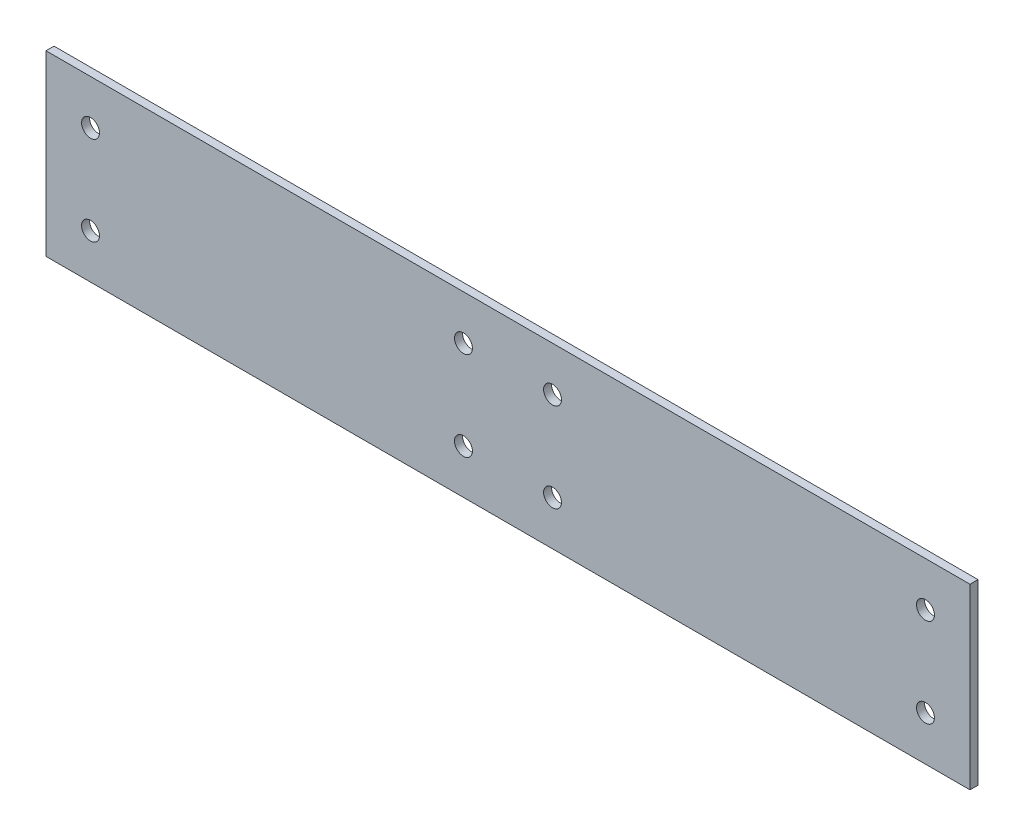
ISO-10303-21;
HEADER;
FILE_DESCRIPTION(('STEP AP214'),'2;1');
FILE_NAME('part.step','',(''),(''),'','','');
FILE_SCHEMA(('AUTOMOTIVE_DESIGN { 1 0 10303 214 1 1 1 1 }'));
ENDSEC;
DATA;
#1=APPLICATION_CONTEXT('core data for automotive mechanical design processes');
#2=APPLICATION_PROTOCOL_DEFINITION('international standard','automotive_design',2000,#1);
#3=PRODUCT_CONTEXT('',#1,'mechanical');
#4=PRODUCT('Part','Part','',(#3));
#5=PRODUCT_RELATED_PRODUCT_CATEGORY('part','',(#4));
#6=PRODUCT_DEFINITION_FORMATION('','',#4);
#7=PRODUCT_DEFINITION_CONTEXT('part definition',#1,'design');
#8=PRODUCT_DEFINITION('design','',#6,#7);
#9=PRODUCT_DEFINITION_SHAPE('','',#8);
#10=(LENGTH_UNIT() NAMED_UNIT(*) SI_UNIT(.MILLI.,.METRE.));
#11=(NAMED_UNIT(*) PLANE_ANGLE_UNIT() SI_UNIT($,.RADIAN.));
#12=(NAMED_UNIT(*) SI_UNIT($,.STERADIAN.) SOLID_ANGLE_UNIT());
#13=UNCERTAINTY_MEASURE_WITH_UNIT(LENGTH_MEASURE(1.E-05),#10,'distance_accuracy_value','');
#14=(GEOMETRIC_REPRESENTATION_CONTEXT(3) GLOBAL_UNCERTAINTY_ASSIGNED_CONTEXT((#13)) GLOBAL_UNIT_ASSIGNED_CONTEXT((#10,
#11,#12)) REPRESENTATION_CONTEXT('',''));
#15=CARTESIAN_POINT('',(0.,0.,0.));
#16=DIRECTION('',(0.,0.,1.));
#17=DIRECTION('',(1.,0.,0.));
#18=AXIS2_PLACEMENT_3D('',#15,#16,#17);
#19=CARTESIAN_POINT('',(131.7625,0.,1.143));
#20=DIRECTION('',(-1.,0.,0.));
#21=DIRECTION('',(0.,0.,1.));
#22=AXIS2_PLACEMENT_3D('',#19,#20,#21);
#23=PLANE('',#22);
#24=DIRECTION('',(0.,1.,0.));
#25=VECTOR('',#24,1.);
#26=CARTESIAN_POINT('',(131.7625,0.,-1.143));
#27=LINE('',#26,#25);
#28=CARTESIAN_POINT('',(131.7625,-25.4,-1.143));
#29=VERTEX_POINT('',#28);
#30=CARTESIAN_POINT('',(131.7625,25.4,-1.143));
#31=VERTEX_POINT('',#30);
#32=EDGE_CURVE('E98',#29,#31,#27,.T.);
#33=ORIENTED_EDGE('',*,*,#32,.T.);
#34=DIRECTION('',(0.,0.,-1.));
#35=VECTOR('',#34,1.);
#36=CARTESIAN_POINT('',(131.7625,25.4,1.143));
#37=LINE('',#36,#35);
#38=CARTESIAN_POINT('',(131.7625,25.4,1.143));
#39=VERTEX_POINT('',#38);
#40=EDGE_CURVE('E11',#39,#31,#37,.T.);
#41=ORIENTED_EDGE('',*,*,#40,.F.);
#42=DIRECTION('',(0.,1.,0.));
#43=VECTOR('',#42,1.);
#44=CARTESIAN_POINT('',(131.7625,0.,1.143));
#45=LINE('',#44,#43);
#46=CARTESIAN_POINT('',(131.7625,-25.4,1.143));
#47=VERTEX_POINT('',#46);
#48=EDGE_CURVE('E86',#47,#39,#45,.T.);
#49=ORIENTED_EDGE('',*,*,#48,.F.);
#50=DIRECTION('',(0.,0.,-1.));
#51=VECTOR('',#50,1.);
#52=CARTESIAN_POINT('',(131.7625,-25.4,1.143));
#53=LINE('',#52,#51);
#54=EDGE_CURVE('E94',#47,#29,#53,.T.);
#55=ORIENTED_EDGE('',*,*,#54,.T.);
#56=EDGE_LOOP('',(#33,#41,#49,#55));
#57=FACE_BOUND('',#56,.T.);
#58=ADVANCED_FACE('F35',(#57),#23,.F.);
#59=CARTESIAN_POINT('',(0.,25.4,1.143));
#60=DIRECTION('',(0.,-1.,0.));
#61=DIRECTION('',(1.,0.,0.));
#62=AXIS2_PLACEMENT_3D('',#59,#60,#61);
#63=PLANE('',#62);
#64=DIRECTION('',(-1.,0.,0.));
#65=VECTOR('',#64,1.);
#66=CARTESIAN_POINT('',(0.,25.4,-1.143));
#67=LINE('',#66,#65);
#68=CARTESIAN_POINT('',(-131.7625,25.4,-1.143));
#69=VERTEX_POINT('',#68);
#70=EDGE_CURVE('E90',#31,#69,#67,.T.);
#71=ORIENTED_EDGE('',*,*,#70,.T.);
#72=DIRECTION('',(0.,0.,-1.));
#73=VECTOR('',#72,1.);
#74=CARTESIAN_POINT('',(-131.7625,25.4,1.143));
#75=LINE('',#74,#73);
#76=CARTESIAN_POINT('',(-131.7625,25.4,1.143));
#77=VERTEX_POINT('',#76);
#78=EDGE_CURVE('E43',#77,#69,#75,.T.);
#79=ORIENTED_EDGE('',*,*,#78,.F.);
#80=DIRECTION('',(-1.,0.,0.));
#81=VECTOR('',#80,1.);
#82=CARTESIAN_POINT('',(0.,25.4,1.143));
#83=LINE('',#82,#81);
#84=EDGE_CURVE('E81',#39,#77,#83,.T.);
#85=ORIENTED_EDGE('',*,*,#84,.F.);
#86=ORIENTED_EDGE('',*,*,#40,.T.);
#87=EDGE_LOOP('',(#71,#79,#85,#86));
#88=FACE_BOUND('',#87,.T.);
#89=ADVANCED_FACE('F89',(#88),#63,.F.);
#90=CARTESIAN_POINT('',(-131.7625,0.,1.143));
#91=DIRECTION('',(1.,0.,0.));
#92=DIRECTION('',(0.,0.,-1.));
#93=AXIS2_PLACEMENT_3D('',#90,#91,#92);
#94=PLANE('',#93);
#95=DIRECTION('',(0.,-1.,0.));
#96=VECTOR('',#95,1.);
#97=CARTESIAN_POINT('',(-131.7625,0.,-1.143));
#98=LINE('',#97,#96);
#99=CARTESIAN_POINT('',(-131.7625,-25.4,-1.143));
#100=VERTEX_POINT('',#99);
#101=EDGE_CURVE('E68',#69,#100,#98,.T.);
#102=ORIENTED_EDGE('',*,*,#101,.T.);
#103=DIRECTION('',(0.,0.,-1.));
#104=VECTOR('',#103,1.);
#105=CARTESIAN_POINT('',(-131.7625,-25.4,1.143));
#106=LINE('',#105,#104);
#107=CARTESIAN_POINT('',(-131.7625,-25.4,1.143));
#108=VERTEX_POINT('',#107);
#109=EDGE_CURVE('E91',#108,#100,#106,.T.);
#110=ORIENTED_EDGE('',*,*,#109,.F.);
#111=DIRECTION('',(0.,-1.,0.));
#112=VECTOR('',#111,1.);
#113=CARTESIAN_POINT('',(-131.7625,0.,1.143));
#114=LINE('',#113,#112);
#115=EDGE_CURVE('E84',#77,#108,#114,.T.);
#116=ORIENTED_EDGE('',*,*,#115,.F.);
#117=ORIENTED_EDGE('',*,*,#78,.T.);
#118=EDGE_LOOP('',(#102,#110,#116,#117));
#119=FACE_BOUND('',#118,.T.);
#120=ADVANCED_FACE('F92',(#119),#94,.F.);
#121=CARTESIAN_POINT('',(0.,-25.4,1.143));
#122=DIRECTION('',(0.,1.,0.));
#123=DIRECTION('',(-1.,0.,0.));
#124=AXIS2_PLACEMENT_3D('',#121,#122,#123);
#125=PLANE('',#124);
#126=DIRECTION('',(1.,0.,0.));
#127=VECTOR('',#126,1.);
#128=CARTESIAN_POINT('',(0.,-25.4,-1.143));
#129=LINE('',#128,#127);
#130=EDGE_CURVE('E74',#100,#29,#129,.T.);
#131=ORIENTED_EDGE('',*,*,#130,.T.);
#132=ORIENTED_EDGE('',*,*,#54,.F.);
#133=DIRECTION('',(1.,0.,0.));
#134=VECTOR('',#133,1.);
#135=CARTESIAN_POINT('',(0.,-25.4,1.143));
#136=LINE('',#135,#134);
#137=EDGE_CURVE('E51',#108,#47,#136,.T.);
#138=ORIENTED_EDGE('',*,*,#137,.F.);
#139=ORIENTED_EDGE('',*,*,#109,.T.);
#140=EDGE_LOOP('',(#131,#132,#138,#139));
#141=FACE_BOUND('',#140,.T.);
#142=ADVANCED_FACE('F106',(#141),#125,.F.);
#143=CARTESIAN_POINT('',(0.,0.,1.143));
#144=DIRECTION('',(0.,0.,1.));
#145=DIRECTION('',(1.,0.,0.));
#146=AXIS2_PLACEMENT_3D('',#143,#144,#145);
#147=PLANE('',#146);
#148=CARTESIAN_POINT('',(-119.0625,12.7,1.143));
#149=DIRECTION('',(0.,0.,1.));
#150=DIRECTION('',(1.,0.,0.));
#151=AXIS2_PLACEMENT_3D('',#148,#149,#150);
#152=CIRCLE('',#151,2.55269999999999);
#153=CARTESIAN_POINT('',(-116.5098,12.7,1.143));
#154=VERTEX_POINT('',#153);
#155=EDGE_CURVE('E156',#154,#154,#152,.T.);
#156=ORIENTED_EDGE('',*,*,#155,.F.);
#157=EDGE_LOOP('',(#156));
#158=FACE_BOUND('',#157,.T.);
#159=CARTESIAN_POINT('',(-119.0625,-12.7,1.143));
#160=DIRECTION('',(0.,0.,1.));
#161=DIRECTION('',(1.,0.,0.));
#162=AXIS2_PLACEMENT_3D('',#159,#160,#161);
#163=CIRCLE('',#162,2.55269999999999);
#164=CARTESIAN_POINT('',(-116.5098,-12.7,1.143));
#165=VERTEX_POINT('',#164);
#166=EDGE_CURVE('E150',#165,#165,#163,.T.);
#167=ORIENTED_EDGE('',*,*,#166,.F.);
#168=EDGE_LOOP('',(#167));
#169=FACE_BOUND('',#168,.T.);
#170=CARTESIAN_POINT('',(-12.7,12.7,1.143));
#171=DIRECTION('',(0.,0.,1.));
#172=DIRECTION('',(1.,0.,0.));
#173=AXIS2_PLACEMENT_3D('',#170,#171,#172);
#174=CIRCLE('',#173,2.55269999999999);
#175=CARTESIAN_POINT('',(-10.1473,12.7,1.143));
#176=VERTEX_POINT('',#175);
#177=EDGE_CURVE('E144',#176,#176,#174,.T.);
#178=ORIENTED_EDGE('',*,*,#177,.F.);
#179=EDGE_LOOP('',(#178));
#180=FACE_BOUND('',#179,.T.);
#181=CARTESIAN_POINT('',(-12.7,-12.7,1.143));
#182=DIRECTION('',(0.,0.,1.));
#183=DIRECTION('',(1.,0.,0.));
#184=AXIS2_PLACEMENT_3D('',#181,#182,#183);
#185=CIRCLE('',#184,2.55269999999999);
#186=CARTESIAN_POINT('',(-10.1473,-12.7,1.143));
#187=VERTEX_POINT('',#186);
#188=EDGE_CURVE('E138',#187,#187,#185,.T.);
#189=ORIENTED_EDGE('',*,*,#188,.F.);
#190=EDGE_LOOP('',(#189));
#191=FACE_BOUND('',#190,.T.);
#192=CARTESIAN_POINT('',(12.7,-12.7,1.143));
#193=DIRECTION('',(0.,0.,1.));
#194=DIRECTION('',(1.,0.,0.));
#195=AXIS2_PLACEMENT_3D('',#192,#193,#194);
#196=CIRCLE('',#195,2.55269999999999);
#197=CARTESIAN_POINT('',(15.2527,-12.7,1.143));
#198=VERTEX_POINT('',#197);
#199=EDGE_CURVE('E132',#198,#198,#196,.T.);
#200=ORIENTED_EDGE('',*,*,#199,.F.);
#201=EDGE_LOOP('',(#200));
#202=FACE_BOUND('',#201,.T.);
#203=CARTESIAN_POINT('',(12.7,12.7,1.143));
#204=DIRECTION('',(0.,0.,1.));
#205=DIRECTION('',(1.,0.,0.));
#206=AXIS2_PLACEMENT_3D('',#203,#204,#205);
#207=CIRCLE('',#206,2.55269999999999);
#208=CARTESIAN_POINT('',(15.2527,12.7,1.143));
#209=VERTEX_POINT('',#208);
#210=EDGE_CURVE('E126',#209,#209,#207,.T.);
#211=ORIENTED_EDGE('',*,*,#210,.F.);
#212=EDGE_LOOP('',(#211));
#213=FACE_BOUND('',#212,.T.);
#214=CARTESIAN_POINT('',(119.0625,12.7,1.143));
#215=DIRECTION('',(0.,0.,1.));
#216=DIRECTION('',(1.,0.,0.));
#217=AXIS2_PLACEMENT_3D('',#214,#215,#216);
#218=CIRCLE('',#217,2.55269999999999);
#219=CARTESIAN_POINT('',(121.6152,12.7,1.143));
#220=VERTEX_POINT('',#219);
#221=EDGE_CURVE('E120',#220,#220,#218,.T.);
#222=ORIENTED_EDGE('',*,*,#221,.F.);
#223=EDGE_LOOP('',(#222));
#224=FACE_BOUND('',#223,.T.);
#225=CARTESIAN_POINT('',(119.0625,-12.7,1.143));
#226=DIRECTION('',(0.,0.,1.));
#227=DIRECTION('',(1.,0.,0.));
#228=AXIS2_PLACEMENT_3D('',#225,#226,#227);
#229=CIRCLE('',#228,2.55269999999999);
#230=CARTESIAN_POINT('',(121.6152,-12.7,1.143));
#231=VERTEX_POINT('',#230);
#232=EDGE_CURVE('E114',#231,#231,#229,.T.);
#233=ORIENTED_EDGE('',*,*,#232,.F.);
#234=EDGE_LOOP('',(#233));
#235=FACE_BOUND('',#234,.T.);
#236=ORIENTED_EDGE('',*,*,#48,.T.);
#237=ORIENTED_EDGE('',*,*,#84,.T.);
#238=ORIENTED_EDGE('',*,*,#115,.T.);
#239=ORIENTED_EDGE('',*,*,#137,.T.);
#240=EDGE_LOOP('',(#236,#237,#238,#239));
#241=FACE_BOUND('',#240,.T.);
#242=ADVANCED_FACE('F82',(#158,#169,#180,#191,#202,#213,#224,#235,#241),#147,.T.);
#243=CARTESIAN_POINT('',(0.,0.,-1.143));
#244=DIRECTION('',(0.,0.,1.));
#245=DIRECTION('',(1.,0.,0.));
#246=AXIS2_PLACEMENT_3D('',#243,#244,#245);
#247=PLANE('',#246);
#248=CARTESIAN_POINT('',(-119.0625,12.7,-1.143));
#249=DIRECTION('',(0.,0.,1.));
#250=DIRECTION('',(1.,0.,0.));
#251=AXIS2_PLACEMENT_3D('',#248,#249,#250);
#252=CIRCLE('',#251,2.55270000000001);
#253=CARTESIAN_POINT('',(-116.5098,12.7,-1.143));
#254=VERTEX_POINT('',#253);
#255=EDGE_CURVE('E153',#254,#254,#252,.T.);
#256=ORIENTED_EDGE('',*,*,#255,.T.);
#257=EDGE_LOOP('',(#256));
#258=FACE_BOUND('',#257,.T.);
#259=CARTESIAN_POINT('',(-119.0625,-12.7,-1.143));
#260=DIRECTION('',(0.,0.,1.));
#261=DIRECTION('',(1.,0.,0.));
#262=AXIS2_PLACEMENT_3D('',#259,#260,#261);
#263=CIRCLE('',#262,2.55270000000001);
#264=CARTESIAN_POINT('',(-116.5098,-12.7,-1.143));
#265=VERTEX_POINT('',#264);
#266=EDGE_CURVE('E147',#265,#265,#263,.T.);
#267=ORIENTED_EDGE('',*,*,#266,.T.);
#268=EDGE_LOOP('',(#267));
#269=FACE_BOUND('',#268,.T.);
#270=CARTESIAN_POINT('',(-12.7,12.7,-1.143));
#271=DIRECTION('',(0.,0.,1.));
#272=DIRECTION('',(1.,0.,0.));
#273=AXIS2_PLACEMENT_3D('',#270,#271,#272);
#274=CIRCLE('',#273,2.5527);
#275=CARTESIAN_POINT('',(-10.1473,12.7,-1.143));
#276=VERTEX_POINT('',#275);
#277=EDGE_CURVE('E141',#276,#276,#274,.T.);
#278=ORIENTED_EDGE('',*,*,#277,.T.);
#279=EDGE_LOOP('',(#278));
#280=FACE_BOUND('',#279,.T.);
#281=CARTESIAN_POINT('',(-12.7,-12.7,-1.143));
#282=DIRECTION('',(0.,0.,1.));
#283=DIRECTION('',(1.,0.,0.));
#284=AXIS2_PLACEMENT_3D('',#281,#282,#283);
#285=CIRCLE('',#284,2.5527);
#286=CARTESIAN_POINT('',(-10.1473,-12.7,-1.143));
#287=VERTEX_POINT('',#286);
#288=EDGE_CURVE('E135',#287,#287,#285,.T.);
#289=ORIENTED_EDGE('',*,*,#288,.T.);
#290=EDGE_LOOP('',(#289));
#291=FACE_BOUND('',#290,.T.);
#292=CARTESIAN_POINT('',(12.7,-12.7,-1.143));
#293=DIRECTION('',(0.,0.,1.));
#294=DIRECTION('',(1.,0.,0.));
#295=AXIS2_PLACEMENT_3D('',#292,#293,#294);
#296=CIRCLE('',#295,2.5527);
#297=CARTESIAN_POINT('',(15.2527,-12.7,-1.143));
#298=VERTEX_POINT('',#297);
#299=EDGE_CURVE('E129',#298,#298,#296,.T.);
#300=ORIENTED_EDGE('',*,*,#299,.T.);
#301=EDGE_LOOP('',(#300));
#302=FACE_BOUND('',#301,.T.);
#303=CARTESIAN_POINT('',(12.7,12.7,-1.143));
#304=DIRECTION('',(0.,0.,1.));
#305=DIRECTION('',(1.,0.,0.));
#306=AXIS2_PLACEMENT_3D('',#303,#304,#305);
#307=CIRCLE('',#306,2.5527);
#308=CARTESIAN_POINT('',(15.2527,12.7,-1.143));
#309=VERTEX_POINT('',#308);
#310=EDGE_CURVE('E123',#309,#309,#307,.T.);
#311=ORIENTED_EDGE('',*,*,#310,.T.);
#312=EDGE_LOOP('',(#311));
#313=FACE_BOUND('',#312,.T.);
#314=CARTESIAN_POINT('',(119.0625,12.7,-1.143));
#315=DIRECTION('',(0.,0.,1.));
#316=DIRECTION('',(1.,0.,0.));
#317=AXIS2_PLACEMENT_3D('',#314,#315,#316);
#318=CIRCLE('',#317,2.55270000000001);
#319=CARTESIAN_POINT('',(121.6152,12.7,-1.143));
#320=VERTEX_POINT('',#319);
#321=EDGE_CURVE('E117',#320,#320,#318,.T.);
#322=ORIENTED_EDGE('',*,*,#321,.T.);
#323=EDGE_LOOP('',(#322));
#324=FACE_BOUND('',#323,.T.);
#325=CARTESIAN_POINT('',(119.0625,-12.7,-1.143));
#326=DIRECTION('',(0.,0.,1.));
#327=DIRECTION('',(1.,0.,0.));
#328=AXIS2_PLACEMENT_3D('',#325,#326,#327);
#329=CIRCLE('',#328,2.55270000000001);
#330=CARTESIAN_POINT('',(121.6152,-12.7,-1.143));
#331=VERTEX_POINT('',#330);
#332=EDGE_CURVE('E101',#331,#331,#329,.T.);
#333=ORIENTED_EDGE('',*,*,#332,.T.);
#334=EDGE_LOOP('',(#333));
#335=FACE_BOUND('',#334,.T.);
#336=ORIENTED_EDGE('',*,*,#32,.F.);
#337=ORIENTED_EDGE('',*,*,#130,.F.);
#338=ORIENTED_EDGE('',*,*,#101,.F.);
#339=ORIENTED_EDGE('',*,*,#70,.F.);
#340=EDGE_LOOP('',(#336,#337,#338,#339));
#341=FACE_BOUND('',#340,.T.);
#342=ADVANCED_FACE('F109',(#258,#269,#280,#291,#302,#313,#324,#335,#341),#247,.F.);
#343=CARTESIAN_POINT('',(119.0625,-12.7,1.143));
#344=DIRECTION('',(0.,0.,1.));
#345=DIRECTION('',(1.,0.,0.));
#346=AXIS2_PLACEMENT_3D('',#343,#344,#345);
#347=CYLINDRICAL_SURFACE('',#346,2.5527);
#348=ORIENTED_EDGE('',*,*,#332,.F.);
#349=EDGE_LOOP('',(#348));
#350=FACE_BOUND('',#349,.T.);
#351=ORIENTED_EDGE('',*,*,#232,.T.);
#352=EDGE_LOOP('',(#351));
#353=FACE_BOUND('',#352,.T.);
#354=ADVANCED_FACE('F179',(#350,#353),#347,.F.);
#355=CARTESIAN_POINT('',(119.0625,12.7,1.143));
#356=DIRECTION('',(0.,0.,1.));
#357=DIRECTION('',(1.,0.,0.));
#358=AXIS2_PLACEMENT_3D('',#355,#356,#357);
#359=CYLINDRICAL_SURFACE('',#358,2.5527);
#360=ORIENTED_EDGE('',*,*,#321,.F.);
#361=EDGE_LOOP('',(#360));
#362=FACE_BOUND('',#361,.T.);
#363=ORIENTED_EDGE('',*,*,#221,.T.);
#364=EDGE_LOOP('',(#363));
#365=FACE_BOUND('',#364,.T.);
#366=ADVANCED_FACE('F181',(#362,#365),#359,.F.);
#367=CARTESIAN_POINT('',(12.7,12.7,1.143));
#368=DIRECTION('',(0.,0.,1.));
#369=DIRECTION('',(1.,0.,0.));
#370=AXIS2_PLACEMENT_3D('',#367,#368,#369);
#371=CYLINDRICAL_SURFACE('',#370,2.55269999999999);
#372=ORIENTED_EDGE('',*,*,#310,.F.);
#373=EDGE_LOOP('',(#372));
#374=FACE_BOUND('',#373,.T.);
#375=ORIENTED_EDGE('',*,*,#210,.T.);
#376=EDGE_LOOP('',(#375));
#377=FACE_BOUND('',#376,.T.);
#378=ADVANCED_FACE('F188',(#374,#377),#371,.F.);
#379=CARTESIAN_POINT('',(12.7,-12.7,1.143));
#380=DIRECTION('',(0.,0.,1.));
#381=DIRECTION('',(1.,0.,0.));
#382=AXIS2_PLACEMENT_3D('',#379,#380,#381);
#383=CYLINDRICAL_SURFACE('',#382,2.55269999999999);
#384=ORIENTED_EDGE('',*,*,#299,.F.);
#385=EDGE_LOOP('',(#384));
#386=FACE_BOUND('',#385,.T.);
#387=ORIENTED_EDGE('',*,*,#199,.T.);
#388=EDGE_LOOP('',(#387));
#389=FACE_BOUND('',#388,.T.);
#390=ADVANCED_FACE('F236',(#386,#389),#383,.F.);
#391=CARTESIAN_POINT('',(-12.7,-12.7,1.143));
#392=DIRECTION('',(0.,0.,1.));
#393=DIRECTION('',(1.,0.,0.));
#394=AXIS2_PLACEMENT_3D('',#391,#392,#393);
#395=CYLINDRICAL_SURFACE('',#394,2.55269999999999);
#396=ORIENTED_EDGE('',*,*,#288,.F.);
#397=EDGE_LOOP('',(#396));
#398=FACE_BOUND('',#397,.T.);
#399=ORIENTED_EDGE('',*,*,#188,.T.);
#400=EDGE_LOOP('',(#399));
#401=FACE_BOUND('',#400,.T.);
#402=ADVANCED_FACE('F246',(#398,#401),#395,.F.);
#403=CARTESIAN_POINT('',(-12.7,12.7,1.143));
#404=DIRECTION('',(0.,0.,1.));
#405=DIRECTION('',(1.,0.,0.));
#406=AXIS2_PLACEMENT_3D('',#403,#404,#405);
#407=CYLINDRICAL_SURFACE('',#406,2.55269999999999);
#408=ORIENTED_EDGE('',*,*,#277,.F.);
#409=EDGE_LOOP('',(#408));
#410=FACE_BOUND('',#409,.T.);
#411=ORIENTED_EDGE('',*,*,#177,.T.);
#412=EDGE_LOOP('',(#411));
#413=FACE_BOUND('',#412,.T.);
#414=ADVANCED_FACE('F256',(#410,#413),#407,.F.);
#415=CARTESIAN_POINT('',(-119.0625,-12.7,1.143));
#416=DIRECTION('',(0.,0.,1.));
#417=DIRECTION('',(1.,0.,0.));
#418=AXIS2_PLACEMENT_3D('',#415,#416,#417);
#419=CYLINDRICAL_SURFACE('',#418,2.5527);
#420=ORIENTED_EDGE('',*,*,#266,.F.);
#421=EDGE_LOOP('',(#420));
#422=FACE_BOUND('',#421,.T.);
#423=ORIENTED_EDGE('',*,*,#166,.T.);
#424=EDGE_LOOP('',(#423));
#425=FACE_BOUND('',#424,.T.);
#426=ADVANCED_FACE('F266',(#422,#425),#419,.F.);
#427=CARTESIAN_POINT('',(-119.0625,12.7,1.143));
#428=DIRECTION('',(0.,0.,1.));
#429=DIRECTION('',(1.,0.,0.));
#430=AXIS2_PLACEMENT_3D('',#427,#428,#429);
#431=CYLINDRICAL_SURFACE('',#430,2.5527);
#432=ORIENTED_EDGE('',*,*,#255,.F.);
#433=EDGE_LOOP('',(#432));
#434=FACE_BOUND('',#433,.T.);
#435=ORIENTED_EDGE('',*,*,#155,.T.);
#436=EDGE_LOOP('',(#435));
#437=FACE_BOUND('',#436,.T.);
#438=ADVANCED_FACE('F160',(#434,#437),#431,.F.);
#439=CLOSED_SHELL('',(#58,#89,#120,#142,#242,#342,#354,#366,#378,#390,#402,#414,#426,#438));
#440=MANIFOLD_SOLID_BREP('B2',#439);
#441=ADVANCED_BREP_SHAPE_REPRESENTATION('',(#18,#440),#14);
#442=SHAPE_DEFINITION_REPRESENTATION(#9,#441);
ENDSEC;
END-ISO-10303-21;
